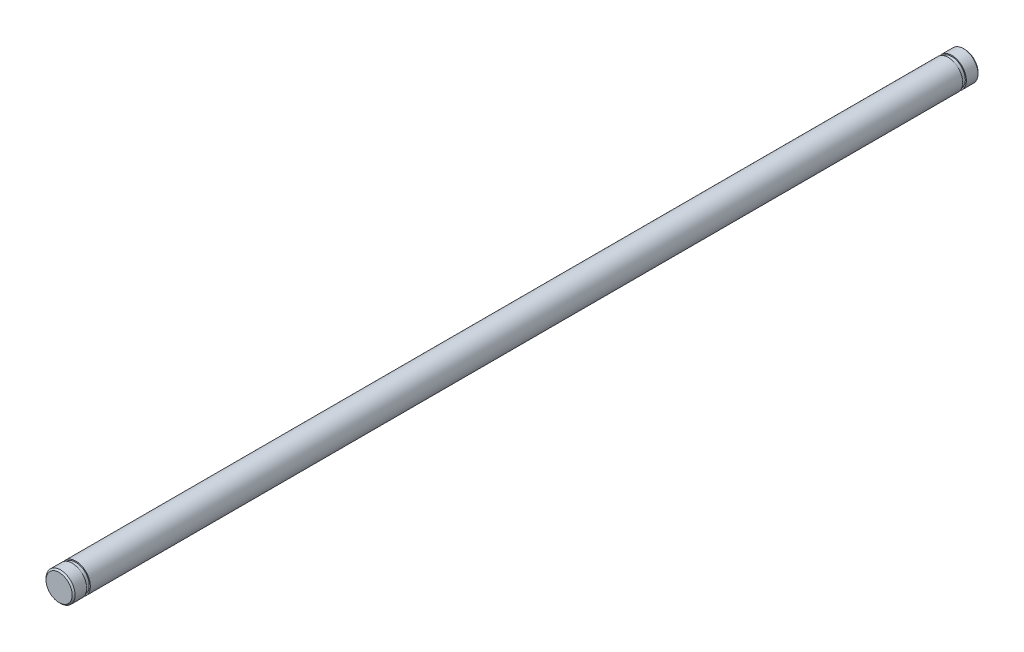
ISO-10303-21;
HEADER;
FILE_DESCRIPTION(('STEP AP214'),'2;1');
FILE_NAME('part.step','',(''),(''),'','','');
FILE_SCHEMA(('AUTOMOTIVE_DESIGN { 1 0 10303 214 1 1 1 1 }'));
ENDSEC;
DATA;
#1=APPLICATION_CONTEXT('core data for automotive mechanical design processes');
#2=APPLICATION_PROTOCOL_DEFINITION('international standard','automotive_design',2000,#1);
#3=PRODUCT_CONTEXT('',#1,'mechanical');
#4=PRODUCT('Part','Part','',(#3));
#5=PRODUCT_RELATED_PRODUCT_CATEGORY('part','',(#4));
#6=PRODUCT_DEFINITION_FORMATION('','',#4);
#7=PRODUCT_DEFINITION_CONTEXT('part definition',#1,'design');
#8=PRODUCT_DEFINITION('design','',#6,#7);
#9=PRODUCT_DEFINITION_SHAPE('','',#8);
#10=(LENGTH_UNIT() NAMED_UNIT(*) SI_UNIT(.MILLI.,.METRE.));
#11=(NAMED_UNIT(*) PLANE_ANGLE_UNIT() SI_UNIT($,.RADIAN.));
#12=(NAMED_UNIT(*) SI_UNIT($,.STERADIAN.) SOLID_ANGLE_UNIT());
#13=UNCERTAINTY_MEASURE_WITH_UNIT(LENGTH_MEASURE(1.E-05),#10,'distance_accuracy_value','');
#14=(GEOMETRIC_REPRESENTATION_CONTEXT(3) GLOBAL_UNCERTAINTY_ASSIGNED_CONTEXT((#13)) GLOBAL_UNIT_ASSIGNED_CONTEXT((#10,
#11,#12)) REPRESENTATION_CONTEXT('',''));
#15=CARTESIAN_POINT('',(0.,0.,0.));
#16=DIRECTION('',(0.,0.,1.));
#17=DIRECTION('',(1.,0.,0.));
#18=AXIS2_PLACEMENT_3D('',#15,#16,#17);
#19=CARTESIAN_POINT('',(0.,0.,62.3));
#20=DIRECTION('',(0.,0.,-1.));
#21=DIRECTION('',(-1.,0.,0.));
#22=AXIS2_PLACEMENT_3D('',#19,#20,#21);
#23=CYLINDRICAL_SURFACE('',#22,2.);
#24=CARTESIAN_POINT('',(0.,0.,62.1));
#25=DIRECTION('',(0.,0.,1.));
#26=DIRECTION('',(1.,0.,0.));
#27=AXIS2_PLACEMENT_3D('',#24,#25,#26);
#28=CIRCLE('',#27,2.);
#29=CARTESIAN_POINT('',(-2.,0.,62.1));
#30=VERTEX_POINT('',#29);
#31=EDGE_CURVE('E10',#30,#30,#28,.F.);
#32=ORIENTED_EDGE('',*,*,#31,.T.);
#33=EDGE_LOOP('',(#32));
#34=FACE_BOUND('',#33,.T.);
#35=CARTESIAN_POINT('',(0.,0.,60.5));
#36=DIRECTION('',(0.,0.,-1.));
#37=DIRECTION('',(-1.,0.,0.));
#38=AXIS2_PLACEMENT_3D('',#35,#36,#37);
#39=CIRCLE('',#38,2.);
#40=CARTESIAN_POINT('',(-2.,0.,60.5));
#41=VERTEX_POINT('',#40);
#42=EDGE_CURVE('E62',#41,#41,#39,.T.);
#43=ORIENTED_EDGE('',*,*,#42,.F.);
#44=EDGE_LOOP('',(#43));
#45=FACE_BOUND('',#44,.T.);
#46=ADVANCED_FACE('F41',(#34,#45),#23,.T.);
#47=CARTESIAN_POINT('',(0.,0.,62.3));
#48=DIRECTION('',(0.,0.,1.));
#49=DIRECTION('',(1.,0.,0.));
#50=AXIS2_PLACEMENT_3D('',#47,#48,#49);
#51=PLANE('',#50);
#52=CARTESIAN_POINT('',(0.,0.,62.3));
#53=DIRECTION('',(0.,0.,1.));
#54=DIRECTION('',(1.,0.,0.));
#55=AXIS2_PLACEMENT_3D('',#52,#53,#54);
#56=CIRCLE('',#55,1.80000000000004);
#57=CARTESIAN_POINT('',(-1.80000000000004,0.,62.3));
#58=VERTEX_POINT('',#57);
#59=EDGE_CURVE('E49',#58,#58,#56,.T.);
#60=ORIENTED_EDGE('',*,*,#59,.T.);
#61=EDGE_LOOP('',(#60));
#62=FACE_BOUND('',#61,.T.);
#63=ADVANCED_FACE('F105',(#62),#51,.T.);
#64=CARTESIAN_POINT('',(0.,2.,60.5));
#65=DIRECTION('',(0.,0.,1.));
#66=DIRECTION('',(1.,0.,0.));
#67=AXIS2_PLACEMENT_3D('',#64,#65,#66);
#68=PLANE('',#67);
#69=CARTESIAN_POINT('',(0.,0.,60.5));
#70=DIRECTION('',(0.,0.,-1.));
#71=DIRECTION('',(-1.,0.,0.));
#72=AXIS2_PLACEMENT_3D('',#69,#70,#71);
#73=CIRCLE('',#72,1.85);
#74=CARTESIAN_POINT('',(-1.85,0.,60.5));
#75=VERTEX_POINT('',#74);
#76=EDGE_CURVE('E78',#75,#75,#73,.T.);
#77=ORIENTED_EDGE('',*,*,#76,.F.);
#78=EDGE_LOOP('',(#77));
#79=FACE_BOUND('',#78,.T.);
#80=ORIENTED_EDGE('',*,*,#42,.T.);
#81=EDGE_LOOP('',(#80));
#82=FACE_BOUND('',#81,.T.);
#83=ADVANCED_FACE('F99',(#79,#82),#68,.F.);
#84=CARTESIAN_POINT('',(0.,0.,-62.3));
#85=DIRECTION('',(0.,0.,-1.));
#86=DIRECTION('',(-1.,0.,0.));
#87=AXIS2_PLACEMENT_3D('',#84,#85,#86);
#88=CYLINDRICAL_SURFACE('',#87,1.85);
#89=CARTESIAN_POINT('',(0.,0.,60.));
#90=DIRECTION('',(0.,0.,-1.));
#91=DIRECTION('',(-1.,0.,0.));
#92=AXIS2_PLACEMENT_3D('',#89,#90,#91);
#93=CIRCLE('',#92,1.85);
#94=CARTESIAN_POINT('',(-1.85,0.,60.));
#95=VERTEX_POINT('',#94);
#96=EDGE_CURVE('E81',#95,#95,#93,.T.);
#97=ORIENTED_EDGE('',*,*,#96,.F.);
#98=EDGE_LOOP('',(#97));
#99=FACE_BOUND('',#98,.T.);
#100=ORIENTED_EDGE('',*,*,#76,.T.);
#101=EDGE_LOOP('',(#100));
#102=FACE_BOUND('',#101,.T.);
#103=ADVANCED_FACE('F93',(#99,#102),#88,.T.);
#104=CARTESIAN_POINT('',(0.,1.85,60.));
#105=DIRECTION('',(0.,0.,-1.));
#106=DIRECTION('',(-1.,0.,0.));
#107=AXIS2_PLACEMENT_3D('',#104,#105,#106);
#108=PLANE('',#107);
#109=CARTESIAN_POINT('',(0.,0.,60.));
#110=DIRECTION('',(0.,0.,-1.));
#111=DIRECTION('',(-1.,0.,0.));
#112=AXIS2_PLACEMENT_3D('',#109,#110,#111);
#113=CIRCLE('',#112,2.);
#114=CARTESIAN_POINT('',(-2.,0.,60.));
#115=VERTEX_POINT('',#114);
#116=EDGE_CURVE('E66',#115,#115,#113,.T.);
#117=ORIENTED_EDGE('',*,*,#116,.F.);
#118=EDGE_LOOP('',(#117));
#119=FACE_BOUND('',#118,.T.);
#120=ORIENTED_EDGE('',*,*,#96,.T.);
#121=EDGE_LOOP('',(#120));
#122=FACE_BOUND('',#121,.T.);
#123=ADVANCED_FACE('F90',(#119,#122),#108,.F.);
#124=ORIENTED_EDGE('',*,*,#116,.T.);
#125=EDGE_LOOP('',(#124));
#126=FACE_BOUND('',#125,.T.);
#127=CARTESIAN_POINT('',(0.,0.,-60.));
#128=DIRECTION('',(0.,0.,-1.));
#129=DIRECTION('',(-1.,0.,0.));
#130=AXIS2_PLACEMENT_3D('',#127,#128,#129);
#131=CIRCLE('',#130,2.);
#132=CARTESIAN_POINT('',(-2.,0.,-60.));
#133=VERTEX_POINT('',#132);
#134=EDGE_CURVE('E63',#133,#133,#131,.T.);
#135=ORIENTED_EDGE('',*,*,#134,.F.);
#136=EDGE_LOOP('',(#135));
#137=FACE_BOUND('',#136,.T.);
#138=ADVANCED_FACE('F87',(#126,#137),#23,.T.);
#139=CARTESIAN_POINT('',(0.,2.,-60.));
#140=DIRECTION('',(0.,0.,1.));
#141=DIRECTION('',(1.,0.,0.));
#142=AXIS2_PLACEMENT_3D('',#139,#140,#141);
#143=PLANE('',#142);
#144=CARTESIAN_POINT('',(0.,0.,-60.));
#145=DIRECTION('',(0.,0.,-1.));
#146=DIRECTION('',(-1.,0.,0.));
#147=AXIS2_PLACEMENT_3D('',#144,#145,#146);
#148=CIRCLE('',#147,1.85);
#149=CARTESIAN_POINT('',(-1.85,0.,-60.));
#150=VERTEX_POINT('',#149);
#151=EDGE_CURVE('E67',#150,#150,#148,.T.);
#152=ORIENTED_EDGE('',*,*,#151,.F.);
#153=EDGE_LOOP('',(#152));
#154=FACE_BOUND('',#153,.T.);
#155=ORIENTED_EDGE('',*,*,#134,.T.);
#156=EDGE_LOOP('',(#155));
#157=FACE_BOUND('',#156,.T.);
#158=ADVANCED_FACE('F119',(#154,#157),#143,.F.);
#159=CARTESIAN_POINT('',(0.,0.,-62.3));
#160=DIRECTION('',(0.,0.,-1.));
#161=DIRECTION('',(-1.,0.,0.));
#162=AXIS2_PLACEMENT_3D('',#159,#160,#161);
#163=CYLINDRICAL_SURFACE('',#162,1.85);
#164=CARTESIAN_POINT('',(0.,0.,-60.5));
#165=DIRECTION('',(0.,0.,-1.));
#166=DIRECTION('',(-1.,0.,0.));
#167=AXIS2_PLACEMENT_3D('',#164,#165,#166);
#168=CIRCLE('',#167,1.85);
#169=CARTESIAN_POINT('',(-1.85,0.,-60.5));
#170=VERTEX_POINT('',#169);
#171=EDGE_CURVE('E70',#170,#170,#168,.T.);
#172=ORIENTED_EDGE('',*,*,#171,.F.);
#173=EDGE_LOOP('',(#172));
#174=FACE_BOUND('',#173,.T.);
#175=ORIENTED_EDGE('',*,*,#151,.T.);
#176=EDGE_LOOP('',(#175));
#177=FACE_BOUND('',#176,.T.);
#178=ADVANCED_FACE('F136',(#174,#177),#163,.T.);
#179=CARTESIAN_POINT('',(0.,1.85,-60.5));
#180=DIRECTION('',(0.,0.,-1.));
#181=DIRECTION('',(-1.,0.,0.));
#182=AXIS2_PLACEMENT_3D('',#179,#180,#181);
#183=PLANE('',#182);
#184=CARTESIAN_POINT('',(0.,0.,-60.5));
#185=DIRECTION('',(0.,0.,-1.));
#186=DIRECTION('',(-1.,0.,0.));
#187=AXIS2_PLACEMENT_3D('',#184,#185,#186);
#188=CIRCLE('',#187,2.);
#189=CARTESIAN_POINT('',(-2.,0.,-60.5));
#190=VERTEX_POINT('',#189);
#191=EDGE_CURVE('E73',#190,#190,#188,.T.);
#192=ORIENTED_EDGE('',*,*,#191,.F.);
#193=EDGE_LOOP('',(#192));
#194=FACE_BOUND('',#193,.T.);
#195=ORIENTED_EDGE('',*,*,#171,.T.);
#196=EDGE_LOOP('',(#195));
#197=FACE_BOUND('',#196,.T.);
#198=ADVANCED_FACE('F129',(#194,#197),#183,.F.);
#199=CARTESIAN_POINT('',(0.,0.,-62.3));
#200=DIRECTION('',(0.,0.,1.));
#201=DIRECTION('',(1.,0.,0.));
#202=AXIS2_PLACEMENT_3D('',#199,#200,#201);
#203=PLANE('',#202);
#204=CARTESIAN_POINT('',(0.,0.,-62.3));
#205=DIRECTION('',(0.,0.,1.));
#206=DIRECTION('',(1.,0.,0.));
#207=AXIS2_PLACEMENT_3D('',#204,#205,#206);
#208=CIRCLE('',#207,1.8);
#209=CARTESIAN_POINT('',(1.8,0.,-62.3));
#210=VERTEX_POINT('',#209);
#211=EDGE_CURVE('E53',#210,#210,#208,.F.);
#212=ORIENTED_EDGE('',*,*,#211,.T.);
#213=EDGE_LOOP('',(#212));
#214=FACE_BOUND('',#213,.T.);
#215=ADVANCED_FACE('F122',(#214),#203,.F.);
#216=CARTESIAN_POINT('',(0.,0.,-62.1));
#217=DIRECTION('',(0.,0.,1.));
#218=DIRECTION('',(1.,0.,0.));
#219=AXIS2_PLACEMENT_3D('',#216,#217,#218);
#220=CIRCLE('',#219,2.);
#221=CARTESIAN_POINT('',(2.,0.,-62.1));
#222=VERTEX_POINT('',#221);
#223=EDGE_CURVE('E57',#222,#222,#220,.T.);
#224=ORIENTED_EDGE('',*,*,#223,.T.);
#225=EDGE_LOOP('',(#224));
#226=FACE_BOUND('',#225,.T.);
#227=ORIENTED_EDGE('',*,*,#191,.T.);
#228=EDGE_LOOP('',(#227));
#229=FACE_BOUND('',#228,.T.);
#230=ADVANCED_FACE('F111',(#226,#229),#23,.T.);
#231=CARTESIAN_POINT('',(0.,0.,-62.1));
#232=DIRECTION('',(0.,0.,1.));
#233=DIRECTION('',(1.,0.,0.));
#234=AXIS2_PLACEMENT_3D('',#231,#232,#233);
#235=CONICAL_SURFACE('',#234,2.,0.785398163397443);
#236=ORIENTED_EDGE('',*,*,#211,.F.);
#237=EDGE_LOOP('',(#236));
#238=FACE_BOUND('',#237,.T.);
#239=ORIENTED_EDGE('',*,*,#223,.F.);
#240=EDGE_LOOP('',(#239));
#241=FACE_BOUND('',#240,.T.);
#242=ADVANCED_FACE('F121',(#238,#241),#235,.T.);
#243=CARTESIAN_POINT('',(0.,0.,62.3));
#244=DIRECTION('',(0.,0.,-1.));
#245=DIRECTION('',(-1.,0.,0.));
#246=AXIS2_PLACEMENT_3D('',#243,#244,#245);
#247=CONICAL_SURFACE('',#246,1.80000000000004,0.785398163397478);
#248=CARTESIAN_POINT('',(-2.,0.,62.1));
#249=CARTESIAN_POINT('',(-1.99791666666667,0.,62.1020833333334));
#250=CARTESIAN_POINT('',(-1.99583333333334,0.,62.1041666666667));
#251=CARTESIAN_POINT('',(-1.99166666666667,0.,62.1083333333334));
#252=CARTESIAN_POINT('',(-1.98958333333334,0.,62.1104166666667));
#253=CARTESIAN_POINT('',(-1.98541666666667,0.,62.1145833333334));
#254=CARTESIAN_POINT('',(-1.98333333333334,0.,62.1166666666667));
#255=CARTESIAN_POINT('',(-1.97916666666667,0.,62.1208333333334));
#256=CARTESIAN_POINT('',(-1.97708333333334,0.,62.1229166666667));
#257=CARTESIAN_POINT('',(-1.97291666666667,0.,62.1270833333334));
#258=CARTESIAN_POINT('',(-1.97083333333334,0.,62.1291666666667));
#259=CARTESIAN_POINT('',(-1.96666666666668,0.,62.1333333333334));
#260=CARTESIAN_POINT('',(-1.96458333333334,0.,62.1354166666667));
#261=CARTESIAN_POINT('',(-1.96041666666668,0.,62.1395833333334));
#262=CARTESIAN_POINT('',(-1.95833333333334,0.,62.1416666666667));
#263=CARTESIAN_POINT('',(-1.95416666666668,0.,62.1458333333334));
#264=CARTESIAN_POINT('',(-1.95208333333335,0.,62.1479166666667));
#265=CARTESIAN_POINT('',(-1.94791666666668,0.,62.1520833333334));
#266=CARTESIAN_POINT('',(-1.94583333333335,0.,62.1541666666667));
#267=CARTESIAN_POINT('',(-1.94166666666668,0.,62.1583333333334));
#268=CARTESIAN_POINT('',(-1.93958333333335,0.,62.1604166666667));
#269=CARTESIAN_POINT('',(-1.93541666666668,0.,62.1645833333334));
#270=CARTESIAN_POINT('',(-1.93333333333335,0.,62.1666666666667));
#271=CARTESIAN_POINT('',(-1.92916666666668,0.,62.1708333333334));
#272=CARTESIAN_POINT('',(-1.92708333333335,0.,62.1729166666667));
#273=CARTESIAN_POINT('',(-1.92291666666668,0.,62.1770833333334));
#274=CARTESIAN_POINT('',(-1.92083333333335,0.,62.1791666666667));
#275=CARTESIAN_POINT('',(-1.91666666666669,0.,62.1833333333334));
#276=CARTESIAN_POINT('',(-1.91458333333335,0.,62.1854166666667));
#277=CARTESIAN_POINT('',(-1.91041666666669,0.,62.1895833333334));
#278=CARTESIAN_POINT('',(-1.90833333333335,0.,62.1916666666667));
#279=CARTESIAN_POINT('',(-1.90416666666669,0.,62.1958333333334));
#280=CARTESIAN_POINT('',(-1.90208333333335,0.,62.1979166666667));
#281=CARTESIAN_POINT('',(-1.89791666666669,0.,62.2020833333333));
#282=CARTESIAN_POINT('',(-1.89583333333336,0.,62.2041666666667));
#283=CARTESIAN_POINT('',(-1.89166666666669,0.,62.2083333333333));
#284=CARTESIAN_POINT('',(-1.88958333333336,0.,62.2104166666667));
#285=CARTESIAN_POINT('',(-1.88541666666669,0.,62.2145833333333));
#286=CARTESIAN_POINT('',(-1.88333333333336,0.,62.2166666666667));
#287=CARTESIAN_POINT('',(-1.87916666666669,0.,62.2208333333333));
#288=CARTESIAN_POINT('',(-1.87708333333336,0.,62.2229166666667));
#289=CARTESIAN_POINT('',(-1.87291666666669,0.,62.2270833333333));
#290=CARTESIAN_POINT('',(-1.87083333333336,0.,62.2291666666667));
#291=CARTESIAN_POINT('',(-1.8666666666667,0.,62.2333333333333));
#292=CARTESIAN_POINT('',(-1.86458333333336,0.,62.2354166666667));
#293=CARTESIAN_POINT('',(-1.8604166666667,0.,62.2395833333333));
#294=CARTESIAN_POINT('',(-1.85833333333336,0.,62.2416666666667));
#295=CARTESIAN_POINT('',(-1.8541666666667,0.,62.2458333333333));
#296=CARTESIAN_POINT('',(-1.85208333333337,0.,62.2479166666667));
#297=CARTESIAN_POINT('',(-1.8479166666667,0.,62.2520833333333));
#298=CARTESIAN_POINT('',(-1.84583333333337,0.,62.2541666666667));
#299=CARTESIAN_POINT('',(-1.8416666666667,0.,62.2583333333333));
#300=CARTESIAN_POINT('',(-1.83958333333337,0.,62.2604166666667));
#301=CARTESIAN_POINT('',(-1.8354166666667,0.,62.2645833333333));
#302=CARTESIAN_POINT('',(-1.83333333333337,0.,62.2666666666667));
#303=CARTESIAN_POINT('',(-1.8291666666667,0.,62.2708333333333));
#304=CARTESIAN_POINT('',(-1.82708333333337,0.,62.2729166666667));
#305=CARTESIAN_POINT('',(-1.8229166666667,0.,62.2770833333333));
#306=CARTESIAN_POINT('',(-1.82083333333337,0.,62.2791666666667));
#307=CARTESIAN_POINT('',(-1.8166666666667,0.,62.2833333333333));
#308=CARTESIAN_POINT('',(-1.81458333333337,0.,62.2854166666667));
#309=CARTESIAN_POINT('',(-1.81041666666671,0.,62.2895833333333));
#310=CARTESIAN_POINT('',(-1.80833333333337,0.,62.2916666666667));
#311=CARTESIAN_POINT('',(-1.80416666666671,0.,62.2958333333333));
#312=CARTESIAN_POINT('',(-1.80208333333337,0.,62.2979166666667));
#313=CARTESIAN_POINT('',(-1.80000000000004,0.,62.3));
#314=B_SPLINE_CURVE_WITH_KNOTS('',3,(#248,#249,#250,#251,#252,#253,#254,#255,#256,#257,#258,
#259,#260,#261,#262,#263,#264,#265,#266,#267,#268,#269,#270,#271,#272,#273,#274,#275,#276,#277,
#278,#279,#280,#281,#282,#283,#284,#285,#286,#287,#288,#289,#290,#291,#292,#293,#294,#295,#296,
#297,#298,#299,#300,#301,#302,#303,#304,#305,#306,#307,#308,#309,#310,#311,#312,#313),
.UNSPECIFIED.,.F.,.F.,(4,2,2,2,2,2,2,2,2,2,2,2,2,2,2,2,2,2,2,2,2,2,2,2,2,2,2,2,2,2,2,2,4),(0.,
0.00883883476483056,0.0176776695296608,0.0265165042944914,0.0353553390593219,0.0441941738241525,
0.0530330085889831,0.0618718433538136,0.0707106781186391,0.0795495128834697,0.0883883476483003,
0.0972271824131307,0.106066017177961,0.114904851942792,0.123743686707622,0.132582521472453,
0.141421356237278,0.150260191002109,0.159099025766939,0.16793786053177,0.176776695296601,
0.185615530061431,0.194454364826261,0.203293199591092,0.212132034355922,0.220970869120748,
0.229809703885579,0.238648538650409,0.24748737341524,0.25632620818007,0.265165042944901,
0.274003877709731,0.282842712474562),.UNSPECIFIED.);
#315=EDGE_CURVE('BSEAM44',#30,#58,#314,.T.);
#316=ORIENTED_EDGE('',*,*,#31,.F.);
#317=ORIENTED_EDGE('',*,*,#59,.F.);
#318=ORIENTED_EDGE('',*,*,#315,.T.);
#319=ORIENTED_EDGE('',*,*,#315,.F.);
#320=EDGE_LOOP('',(#316,#318,#317,#319));
#321=FACE_BOUND('',#320,.T.);
#322=ADVANCED_FACE('F44',(#321),#247,.T.);
#323=CLOSED_SHELL('',(#46,#63,#83,#103,#123,#138,#158,#178,#198,#215,#230,#242,#322));
#324=MANIFOLD_SOLID_BREP('B2',#323);
#325=ADVANCED_BREP_SHAPE_REPRESENTATION('',(#18,#324),#14);
#326=SHAPE_DEFINITION_REPRESENTATION(#9,#325);
ENDSEC;
END-ISO-10303-21;
